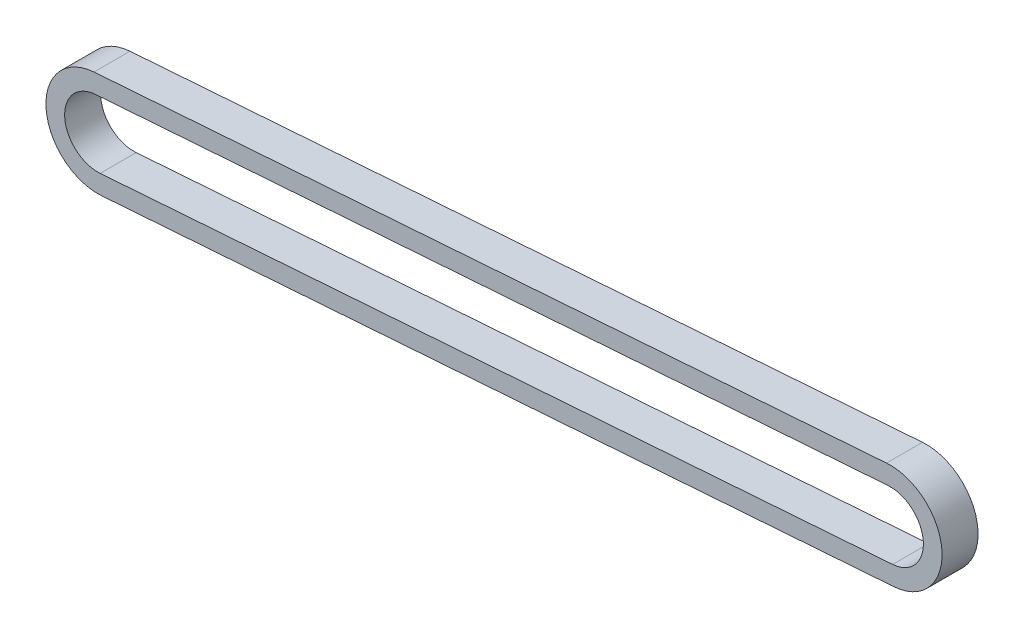
ISO-10303-21;
HEADER;
FILE_DESCRIPTION(('STEP AP214'),'2;1');
FILE_NAME('part.step','',(''),(''),'','','');
FILE_SCHEMA(('AUTOMOTIVE_DESIGN { 1 0 10303 214 1 1 1 1 }'));
ENDSEC;
DATA;
#1=APPLICATION_CONTEXT('core data for automotive mechanical design processes');
#2=APPLICATION_PROTOCOL_DEFINITION('international standard','automotive_design',2000,#1);
#3=PRODUCT_CONTEXT('',#1,'mechanical');
#4=PRODUCT('Part','Part','',(#3));
#5=PRODUCT_RELATED_PRODUCT_CATEGORY('part','',(#4));
#6=PRODUCT_DEFINITION_FORMATION('','',#4);
#7=PRODUCT_DEFINITION_CONTEXT('part definition',#1,'design');
#8=PRODUCT_DEFINITION('design','',#6,#7);
#9=PRODUCT_DEFINITION_SHAPE('','',#8);
#10=(LENGTH_UNIT() NAMED_UNIT(*) SI_UNIT(.MILLI.,.METRE.));
#11=(NAMED_UNIT(*) PLANE_ANGLE_UNIT() SI_UNIT($,.RADIAN.));
#12=(NAMED_UNIT(*) SI_UNIT($,.STERADIAN.) SOLID_ANGLE_UNIT());
#13=UNCERTAINTY_MEASURE_WITH_UNIT(LENGTH_MEASURE(1.E-05),#10,'distance_accuracy_value','');
#14=(GEOMETRIC_REPRESENTATION_CONTEXT(3) GLOBAL_UNCERTAINTY_ASSIGNED_CONTEXT((#13)) GLOBAL_UNIT_ASSIGNED_CONTEXT((#10,
#11,#12)) REPRESENTATION_CONTEXT('',''));
#15=CARTESIAN_POINT('',(0.,0.,0.));
#16=DIRECTION('',(0.,0.,1.));
#17=DIRECTION('',(1.,0.,0.));
#18=AXIS2_PLACEMENT_3D('',#15,#16,#17);
#19=CARTESIAN_POINT('',(69.9196997705225,5.08,3.175));
#20=DIRECTION('',(0.,0.,1.));
#21=DIRECTION('',(1.,0.,0.));
#22=AXIS2_PLACEMENT_3D('',#19,#20,#21);
#23=PLANE('',#22);
#24=CARTESIAN_POINT('',(69.9196997705225,5.08,3.175));
#25=DIRECTION('',(0.,0.,1.));
#26=DIRECTION('',(1.,0.,0.));
#27=AXIS2_PLACEMENT_3D('',#24,#25,#26);
#28=CIRCLE('',#27,4.572);
#29=CARTESIAN_POINT('',(70.2510041183486,0.520019580183319,3.175));
#30=VERTEX_POINT('',#29);
#31=CARTESIAN_POINT('',(69.5883954226964,9.63998041981668,3.175));
#32=VERTEX_POINT('',#31);
#33=EDGE_CURVE('E153',#30,#32,#28,.T.);
#34=ORIENTED_EDGE('',*,*,#33,.T.);
#35=DIRECTION('',(-0.997371045454218,-0.0724637681159421,0.));
#36=VECTOR('',#35,1.);
#37=CARTESIAN_POINT('',(69.5883954226964,9.63998041981668,3.175));
#38=LINE('',#37,#36);
#39=CARTESIAN_POINT('',(-0.331304347826114,4.55998041981668,3.175));
#40=VERTEX_POINT('',#39);
#41=EDGE_CURVE('E157',#32,#40,#38,.T.);
#42=ORIENTED_EDGE('',*,*,#41,.T.);
#43=CARTESIAN_POINT('',(0.,0.,3.175));
#44=DIRECTION('',(0.,0.,1.));
#45=DIRECTION('',(1.,0.,0.));
#46=AXIS2_PLACEMENT_3D('',#43,#44,#45);
#47=CIRCLE('',#46,4.572);
#48=CARTESIAN_POINT('',(0.331304347826088,-4.55998041981669,3.175));
#49=VERTEX_POINT('',#48);
#50=EDGE_CURVE('E161',#40,#49,#47,.T.);
#51=ORIENTED_EDGE('',*,*,#50,.T.);
#52=DIRECTION('',(0.997371045454218,0.0724637681159421,0.));
#53=VECTOR('',#52,1.);
#54=CARTESIAN_POINT('',(0.331304347826088,-4.55998041981668,3.175));
#55=LINE('',#54,#53);
#56=EDGE_CURVE('E164',#49,#30,#55,.T.);
#57=ORIENTED_EDGE('',*,*,#56,.T.);
#58=EDGE_LOOP('',(#34,#42,#51,#57));
#59=FACE_BOUND('',#58,.T.);
#60=DIRECTION('',(-0.997371045454218,-0.072463768115942,0.));
#61=VECTOR('',#60,1.);
#62=CARTESIAN_POINT('',(69.7080331038558,7.99332082377177,3.175));
#63=LINE('',#62,#61);
#64=CARTESIAN_POINT('',(69.7080331038558,7.99332082377177,3.175));
#65=VERTEX_POINT('',#64);
#66=CARTESIAN_POINT('',(-0.211666666666667,2.91332082377177,3.175));
#67=VERTEX_POINT('',#66);
#68=EDGE_CURVE('E114',#65,#67,#63,.T.);
#69=ORIENTED_EDGE('',*,*,#68,.F.);
#70=CARTESIAN_POINT('',(69.9196997705225,5.08,3.175));
#71=DIRECTION('',(0.,0.,1.));
#72=DIRECTION('',(1.,0.,0.));
#73=AXIS2_PLACEMENT_3D('',#70,#71,#72);
#74=CIRCLE('',#73,2.921);
#75=CARTESIAN_POINT('',(70.1313664371891,2.16667917622823,3.175));
#76=VERTEX_POINT('',#75);
#77=EDGE_CURVE('E105',#76,#65,#74,.T.);
#78=ORIENTED_EDGE('',*,*,#77,.F.);
#79=DIRECTION('',(0.997371045454218,0.0724637681159421,0.));
#80=VECTOR('',#79,1.);
#81=CARTESIAN_POINT('',(0.211666666666667,-2.91332082377177,3.175));
#82=LINE('',#81,#80);
#83=CARTESIAN_POINT('',(0.211666666666666,-2.91332082377177,3.175));
#84=VERTEX_POINT('',#83);
#85=EDGE_CURVE('E131',#84,#76,#82,.T.);
#86=ORIENTED_EDGE('',*,*,#85,.F.);
#87=CARTESIAN_POINT('',(0.,0.,3.175));
#88=DIRECTION('',(0.,0.,1.));
#89=DIRECTION('',(1.,0.,0.));
#90=AXIS2_PLACEMENT_3D('',#87,#88,#89);
#91=CIRCLE('',#90,2.921);
#92=EDGE_CURVE('E127',#67,#84,#91,.T.);
#93=ORIENTED_EDGE('',*,*,#92,.F.);
#94=EDGE_LOOP('',(#69,#78,#86,#93));
#95=FACE_BOUND('',#94,.T.);
#96=ADVANCED_FACE('F39',(#59,#95),#23,.T.);
#97=CARTESIAN_POINT('',(69.9196997705225,5.08,0.));
#98=DIRECTION('',(0.,0.,1.));
#99=DIRECTION('',(1.,0.,0.));
#100=AXIS2_PLACEMENT_3D('',#97,#98,#99);
#101=PLANE('',#100);
#102=CARTESIAN_POINT('',(69.9196997705225,5.08,0.));
#103=DIRECTION('',(0.,0.,1.));
#104=DIRECTION('',(1.,0.,0.));
#105=AXIS2_PLACEMENT_3D('',#102,#103,#104);
#106=CIRCLE('',#105,4.572);
#107=CARTESIAN_POINT('',(70.2510041183486,0.520019580183319,0.));
#108=VERTEX_POINT('',#107);
#109=CARTESIAN_POINT('',(69.5883954226964,9.63998041981668,0.));
#110=VERTEX_POINT('',#109);
#111=EDGE_CURVE('E123',#108,#110,#106,.T.);
#112=ORIENTED_EDGE('',*,*,#111,.F.);
#113=DIRECTION('',(0.997371045454218,0.0724637681159421,0.));
#114=VECTOR('',#113,1.);
#115=CARTESIAN_POINT('',(0.331304347826088,-4.55998041981668,0.));
#116=LINE('',#115,#114);
#117=CARTESIAN_POINT('',(0.331304347826088,-4.55998041981669,0.));
#118=VERTEX_POINT('',#117);
#119=EDGE_CURVE('E158',#118,#108,#116,.T.);
#120=ORIENTED_EDGE('',*,*,#119,.F.);
#121=CARTESIAN_POINT('',(0.,0.,0.));
#122=DIRECTION('',(0.,0.,1.));
#123=DIRECTION('',(1.,0.,0.));
#124=AXIS2_PLACEMENT_3D('',#121,#122,#123);
#125=CIRCLE('',#124,4.572);
#126=CARTESIAN_POINT('',(-0.331304347826114,4.55998041981668,0.));
#127=VERTEX_POINT('',#126);
#128=EDGE_CURVE('E174',#127,#118,#125,.T.);
#129=ORIENTED_EDGE('',*,*,#128,.F.);
#130=DIRECTION('',(-0.997371045454218,-0.0724637681159421,0.));
#131=VECTOR('',#130,1.);
#132=CARTESIAN_POINT('',(69.5883954226964,9.63998041981668,0.));
#133=LINE('',#132,#131);
#134=EDGE_CURVE('E171',#110,#127,#133,.T.);
#135=ORIENTED_EDGE('',*,*,#134,.F.);
#136=EDGE_LOOP('',(#112,#120,#129,#135));
#137=FACE_BOUND('',#136,.T.);
#138=CARTESIAN_POINT('',(69.9196997705225,5.08,0.));
#139=DIRECTION('',(0.,0.,1.));
#140=DIRECTION('',(1.,0.,0.));
#141=AXIS2_PLACEMENT_3D('',#138,#139,#140);
#142=CIRCLE('',#141,2.921);
#143=CARTESIAN_POINT('',(70.1313664371891,2.16667917622823,0.));
#144=VERTEX_POINT('',#143);
#145=CARTESIAN_POINT('',(69.7080331038558,7.99332082377177,0.));
#146=VERTEX_POINT('',#145);
#147=EDGE_CURVE('E63',#144,#146,#142,.T.);
#148=ORIENTED_EDGE('',*,*,#147,.T.);
#149=DIRECTION('',(-0.997371045454218,-0.072463768115942,0.));
#150=VECTOR('',#149,1.);
#151=CARTESIAN_POINT('',(69.7080331038558,7.99332082377177,0.));
#152=LINE('',#151,#150);
#153=CARTESIAN_POINT('',(-0.211666666666667,2.91332082377177,0.));
#154=VERTEX_POINT('',#153);
#155=EDGE_CURVE('E121',#146,#154,#152,.T.);
#156=ORIENTED_EDGE('',*,*,#155,.T.);
#157=CARTESIAN_POINT('',(0.,0.,0.));
#158=DIRECTION('',(0.,0.,1.));
#159=DIRECTION('',(1.,0.,0.));
#160=AXIS2_PLACEMENT_3D('',#157,#158,#159);
#161=CIRCLE('',#160,2.921);
#162=CARTESIAN_POINT('',(0.211666666666668,-2.91332082377177,0.));
#163=VERTEX_POINT('',#162);
#164=EDGE_CURVE('E140',#154,#163,#161,.T.);
#165=ORIENTED_EDGE('',*,*,#164,.T.);
#166=DIRECTION('',(0.997371045454218,0.0724637681159421,0.));
#167=VECTOR('',#166,1.);
#168=CARTESIAN_POINT('',(0.211666666666667,-2.91332082377177,0.));
#169=LINE('',#168,#167);
#170=EDGE_CURVE('E115',#163,#144,#169,.T.);
#171=ORIENTED_EDGE('',*,*,#170,.T.);
#172=EDGE_LOOP('',(#148,#156,#165,#171));
#173=FACE_BOUND('',#172,.T.);
#174=ADVANCED_FACE('F197',(#137,#173),#101,.F.);
#175=CARTESIAN_POINT('',(69.9196997705225,5.08,3.175));
#176=DIRECTION('',(0.,0.,-1.));
#177=DIRECTION('',(-1.,0.,0.));
#178=AXIS2_PLACEMENT_3D('',#175,#176,#177);
#179=CYLINDRICAL_SURFACE('',#178,4.572);
#180=ORIENTED_EDGE('',*,*,#111,.T.);
#181=DIRECTION('',(0.,0.,-1.));
#182=VECTOR('',#181,1.);
#183=CARTESIAN_POINT('',(69.5883954226964,9.63998041981668,3.175));
#184=LINE('',#183,#182);
#185=EDGE_CURVE('E11',#32,#110,#184,.T.);
#186=ORIENTED_EDGE('',*,*,#185,.F.);
#187=ORIENTED_EDGE('',*,*,#33,.F.);
#188=DIRECTION('',(0.,0.,-1.));
#189=VECTOR('',#188,1.);
#190=CARTESIAN_POINT('',(70.2510041183486,0.520019580183319,3.175));
#191=LINE('',#190,#189);
#192=EDGE_CURVE('E167',#30,#108,#191,.T.);
#193=ORIENTED_EDGE('',*,*,#192,.T.);
#194=EDGE_LOOP('',(#180,#186,#187,#193));
#195=FACE_BOUND('',#194,.T.);
#196=ADVANCED_FACE('F41',(#195),#179,.T.);
#197=CARTESIAN_POINT('',(69.5883954226964,9.63998041981668,3.175));
#198=DIRECTION('',(0.0724637681159421,-0.997371045454218,0.));
#199=DIRECTION('',(0.997371045454218,0.0724637681159421,0.));
#200=AXIS2_PLACEMENT_3D('',#197,#198,#199);
#201=PLANE('',#200);
#202=ORIENTED_EDGE('',*,*,#134,.T.);
#203=DIRECTION('',(0.,0.,-1.));
#204=VECTOR('',#203,1.);
#205=CARTESIAN_POINT('',(-0.331304347826114,4.55998041981668,3.175));
#206=LINE('',#205,#204);
#207=EDGE_CURVE('E48',#40,#127,#206,.T.);
#208=ORIENTED_EDGE('',*,*,#207,.F.);
#209=ORIENTED_EDGE('',*,*,#41,.F.);
#210=ORIENTED_EDGE('',*,*,#185,.T.);
#211=EDGE_LOOP('',(#202,#208,#209,#210));
#212=FACE_BOUND('',#211,.T.);
#213=ADVANCED_FACE('F207',(#212),#201,.F.);
#214=CARTESIAN_POINT('',(0.,0.,3.175));
#215=DIRECTION('',(0.,0.,-1.));
#216=DIRECTION('',(-1.,0.,0.));
#217=AXIS2_PLACEMENT_3D('',#214,#215,#216);
#218=CYLINDRICAL_SURFACE('',#217,4.572);
#219=ORIENTED_EDGE('',*,*,#128,.T.);
#220=DIRECTION('',(0.,0.,-1.));
#221=VECTOR('',#220,1.);
#222=CARTESIAN_POINT('',(0.331304347826088,-4.55998041981669,3.175));
#223=LINE('',#222,#221);
#224=EDGE_CURVE('E182',#49,#118,#223,.T.);
#225=ORIENTED_EDGE('',*,*,#224,.F.);
#226=ORIENTED_EDGE('',*,*,#50,.F.);
#227=ORIENTED_EDGE('',*,*,#207,.T.);
#228=EDGE_LOOP('',(#219,#225,#226,#227));
#229=FACE_BOUND('',#228,.T.);
#230=ADVANCED_FACE('F191',(#229),#218,.T.);
#231=CARTESIAN_POINT('',(0.331304347826088,-4.55998041981668,3.175));
#232=DIRECTION('',(-0.0724637681159421,0.997371045454218,0.));
#233=DIRECTION('',(-0.997371045454218,-0.0724637681159421,0.));
#234=AXIS2_PLACEMENT_3D('',#231,#232,#233);
#235=PLANE('',#234);
#236=ORIENTED_EDGE('',*,*,#119,.T.);
#237=ORIENTED_EDGE('',*,*,#192,.F.);
#238=ORIENTED_EDGE('',*,*,#56,.F.);
#239=ORIENTED_EDGE('',*,*,#224,.T.);
#240=EDGE_LOOP('',(#236,#237,#238,#239));
#241=FACE_BOUND('',#240,.T.);
#242=ADVANCED_FACE('F201',(#241),#235,.F.);
#243=CARTESIAN_POINT('',(69.9196997705225,5.08,3.175));
#244=DIRECTION('',(0.,0.,-1.));
#245=DIRECTION('',(-1.,0.,0.));
#246=AXIS2_PLACEMENT_3D('',#243,#244,#245);
#247=CYLINDRICAL_SURFACE('',#246,2.921);
#248=ORIENTED_EDGE('',*,*,#147,.F.);
#249=DIRECTION('',(0.,0.,-1.));
#250=VECTOR('',#249,1.);
#251=CARTESIAN_POINT('',(70.1313664371891,2.16667917622823,3.175));
#252=LINE('',#251,#250);
#253=EDGE_CURVE('E109',#76,#144,#252,.T.);
#254=ORIENTED_EDGE('',*,*,#253,.F.);
#255=ORIENTED_EDGE('',*,*,#77,.T.);
#256=DIRECTION('',(0.,0.,-1.));
#257=VECTOR('',#256,1.);
#258=CARTESIAN_POINT('',(69.7080331038558,7.99332082377177,3.175));
#259=LINE('',#258,#257);
#260=EDGE_CURVE('E108',#65,#146,#259,.T.);
#261=ORIENTED_EDGE('',*,*,#260,.T.);
#262=EDGE_LOOP('',(#248,#254,#255,#261));
#263=FACE_BOUND('',#262,.T.);
#264=ADVANCED_FACE('F107',(#263),#247,.F.);
#265=CARTESIAN_POINT('',(69.7080331038558,7.99332082377177,3.175));
#266=DIRECTION('',(0.0724637681159421,-0.997371045454218,0.));
#267=DIRECTION('',(0.997371045454218,0.0724637681159421,0.));
#268=AXIS2_PLACEMENT_3D('',#265,#266,#267);
#269=PLANE('',#268);
#270=ORIENTED_EDGE('',*,*,#155,.F.);
#271=ORIENTED_EDGE('',*,*,#260,.F.);
#272=ORIENTED_EDGE('',*,*,#68,.T.);
#273=DIRECTION('',(0.,0.,-1.));
#274=VECTOR('',#273,1.);
#275=CARTESIAN_POINT('',(-0.211666666666667,2.91332082377177,3.175));
#276=LINE('',#275,#274);
#277=EDGE_CURVE('E124',#67,#154,#276,.T.);
#278=ORIENTED_EDGE('',*,*,#277,.T.);
#279=EDGE_LOOP('',(#270,#271,#272,#278));
#280=FACE_BOUND('',#279,.T.);
#281=ADVANCED_FACE('F118',(#280),#269,.T.);
#282=CARTESIAN_POINT('',(0.,0.,3.175));
#283=DIRECTION('',(0.,0.,-1.));
#284=DIRECTION('',(-1.,0.,0.));
#285=AXIS2_PLACEMENT_3D('',#282,#283,#284);
#286=CYLINDRICAL_SURFACE('',#285,2.921);
#287=ORIENTED_EDGE('',*,*,#164,.F.);
#288=ORIENTED_EDGE('',*,*,#277,.F.);
#289=ORIENTED_EDGE('',*,*,#92,.T.);
#290=DIRECTION('',(0.,0.,-1.));
#291=VECTOR('',#290,1.);
#292=CARTESIAN_POINT('',(0.211666666666668,-2.91332082377177,3.175));
#293=LINE('',#292,#291);
#294=EDGE_CURVE('E55',#84,#163,#293,.T.);
#295=ORIENTED_EDGE('',*,*,#294,.T.);
#296=EDGE_LOOP('',(#287,#288,#289,#295));
#297=FACE_BOUND('',#296,.T.);
#298=ADVANCED_FACE('F230',(#297),#286,.F.);
#299=CARTESIAN_POINT('',(0.211666666666667,-2.91332082377177,3.175));
#300=DIRECTION('',(-0.0724637681159421,0.997371045454218,0.));
#301=DIRECTION('',(-0.997371045454218,-0.0724637681159421,0.));
#302=AXIS2_PLACEMENT_3D('',#299,#300,#301);
#303=PLANE('',#302);
#304=ORIENTED_EDGE('',*,*,#170,.F.);
#305=ORIENTED_EDGE('',*,*,#294,.F.);
#306=ORIENTED_EDGE('',*,*,#85,.T.);
#307=ORIENTED_EDGE('',*,*,#253,.T.);
#308=EDGE_LOOP('',(#304,#305,#306,#307));
#309=FACE_BOUND('',#308,.T.);
#310=ADVANCED_FACE('F234',(#309),#303,.T.);
#311=CLOSED_SHELL('',(#96,#174,#196,#213,#230,#242,#264,#281,#298,#310));
#312=MANIFOLD_SOLID_BREP('B2',#311);
#313=ADVANCED_BREP_SHAPE_REPRESENTATION('',(#18,#312),#14);
#314=SHAPE_DEFINITION_REPRESENTATION(#9,#313);
ENDSEC;
END-ISO-10303-21;
